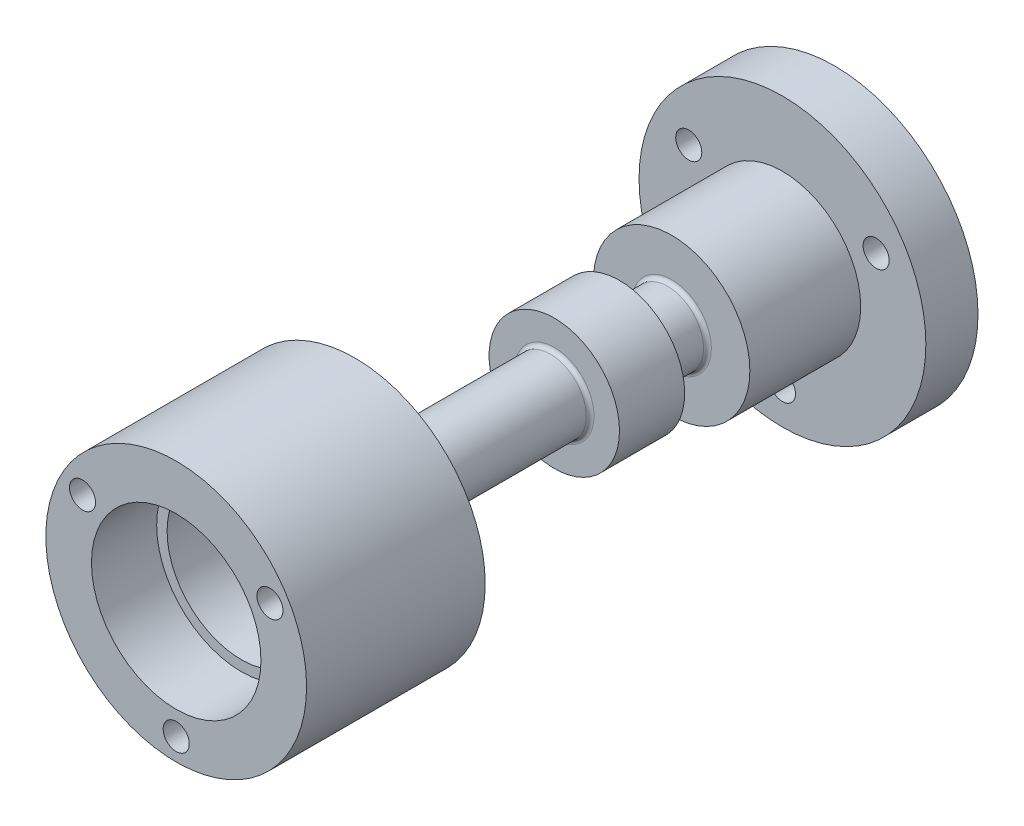
ISO-10303-21;
HEADER;
FILE_DESCRIPTION(('STEP AP214'),'2;1');
FILE_NAME('part.step','',(''),(''),'','','');
FILE_SCHEMA(('AUTOMOTIVE_DESIGN { 1 0 10303 214 1 1 1 1 }'));
ENDSEC;
DATA;
#1=APPLICATION_CONTEXT('core data for automotive mechanical design processes');
#2=APPLICATION_PROTOCOL_DEFINITION('international standard','automotive_design',2000,#1);
#3=PRODUCT_CONTEXT('',#1,'mechanical');
#4=PRODUCT('Part','Part','',(#3));
#5=PRODUCT_RELATED_PRODUCT_CATEGORY('part','',(#4));
#6=PRODUCT_DEFINITION_FORMATION('','',#4);
#7=PRODUCT_DEFINITION_CONTEXT('part definition',#1,'design');
#8=PRODUCT_DEFINITION('design','',#6,#7);
#9=PRODUCT_DEFINITION_SHAPE('','',#8);
#10=(LENGTH_UNIT() NAMED_UNIT(*) SI_UNIT(.MILLI.,.METRE.));
#11=(NAMED_UNIT(*) PLANE_ANGLE_UNIT() SI_UNIT($,.RADIAN.));
#12=(NAMED_UNIT(*) SI_UNIT($,.STERADIAN.) SOLID_ANGLE_UNIT());
#13=UNCERTAINTY_MEASURE_WITH_UNIT(LENGTH_MEASURE(1.E-05),#10,'distance_accuracy_value','');
#14=(GEOMETRIC_REPRESENTATION_CONTEXT(3) GLOBAL_UNCERTAINTY_ASSIGNED_CONTEXT((#13)) GLOBAL_UNIT_ASSIGNED_CONTEXT((#10,
#11,#12)) REPRESENTATION_CONTEXT('',''));
#15=CARTESIAN_POINT('',(0.,0.,0.));
#16=DIRECTION('',(0.,0.,1.));
#17=DIRECTION('',(1.,0.,0.));
#18=AXIS2_PLACEMENT_3D('',#15,#16,#17);
#19=CARTESIAN_POINT('',(0.,0.,32.81));
#20=DIRECTION('',(0.,0.,-1.));
#21=DIRECTION('',(-1.,0.,0.));
#22=AXIS2_PLACEMENT_3D('',#19,#20,#21);
#23=CYLINDRICAL_SURFACE('',#22,2.75);
#24=CARTESIAN_POINT('',(0.,0.,17.8));
#25=DIRECTION('',(0.,0.,1.));
#26=DIRECTION('',(1.,0.,0.));
#27=AXIS2_PLACEMENT_3D('',#24,#25,#26);
#28=CIRCLE('',#27,2.75);
#29=CARTESIAN_POINT('',(2.75,0.,17.8));
#30=VERTEX_POINT('',#29);
#31=EDGE_CURVE('E65',#30,#30,#28,.T.);
#32=ORIENTED_EDGE('',*,*,#31,.T.);
#33=EDGE_LOOP('',(#32));
#34=FACE_BOUND('',#33,.T.);
#35=CARTESIAN_POINT('',(0.,0.,32.8));
#36=DIRECTION('',(0.,0.,1.));
#37=DIRECTION('',(1.,0.,0.));
#38=AXIS2_PLACEMENT_3D('',#35,#36,#37);
#39=CIRCLE('',#38,2.75);
#40=CARTESIAN_POINT('',(2.75,0.,32.8));
#41=VERTEX_POINT('',#40);
#42=EDGE_CURVE('E63',#41,#41,#39,.T.);
#43=ORIENTED_EDGE('',*,*,#42,.F.);
#44=EDGE_LOOP('',(#43));
#45=FACE_BOUND('',#44,.T.);
#46=ADVANCED_FACE('F39',(#34,#45),#23,.T.);
#47=CARTESIAN_POINT('',(0.,0.,35.));
#48=DIRECTION('',(0.,0.,-1.));
#49=DIRECTION('',(-1.,0.,0.));
#50=AXIS2_PLACEMENT_3D('',#47,#48,#49);
#51=CYLINDRICAL_SURFACE('',#50,10.);
#52=CARTESIAN_POINT('',(0.,0.,32.8));
#53=DIRECTION('',(0.,0.,1.));
#54=DIRECTION('',(1.,0.,0.));
#55=AXIS2_PLACEMENT_3D('',#52,#53,#54);
#56=CIRCLE('',#55,10.);
#57=CARTESIAN_POINT('',(10.,0.,32.8));
#58=VERTEX_POINT('',#57);
#59=EDGE_CURVE('E71',#58,#58,#56,.T.);
#60=ORIENTED_EDGE('',*,*,#59,.T.);
#61=EDGE_LOOP('',(#60));
#62=FACE_BOUND('',#61,.T.);
#63=CARTESIAN_POINT('',(0.,0.,46.5));
#64=DIRECTION('',(0.,0.,1.));
#65=DIRECTION('',(1.,0.,0.));
#66=AXIS2_PLACEMENT_3D('',#63,#64,#65);
#67=CIRCLE('',#66,10.);
#68=CARTESIAN_POINT('',(10.,0.,46.5));
#69=VERTEX_POINT('',#68);
#70=EDGE_CURVE('E82',#69,#69,#67,.T.);
#71=ORIENTED_EDGE('',*,*,#70,.F.);
#72=EDGE_LOOP('',(#71));
#73=FACE_BOUND('',#72,.T.);
#74=ADVANCED_FACE('F164',(#62,#73),#51,.T.);
#75=CARTESIAN_POINT('',(0.,0.,32.8));
#76=DIRECTION('',(0.,0.,1.));
#77=DIRECTION('',(1.,0.,0.));
#78=AXIS2_PLACEMENT_3D('',#75,#76,#77);
#79=PLANE('',#78);
#80=ORIENTED_EDGE('',*,*,#42,.T.);
#81=EDGE_LOOP('',(#80));
#82=FACE_BOUND('',#81,.T.);
#83=ORIENTED_EDGE('',*,*,#59,.F.);
#84=EDGE_LOOP('',(#83));
#85=FACE_BOUND('',#84,.T.);
#86=ADVANCED_FACE('F175',(#82,#85),#79,.F.);
#87=CARTESIAN_POINT('',(0.,0.,46.5));
#88=DIRECTION('',(0.,0.,1.));
#89=DIRECTION('',(1.,0.,0.));
#90=AXIS2_PLACEMENT_3D('',#87,#88,#89);
#91=PLANE('',#90);
#92=CARTESIAN_POINT('',(7.18801085141084,4.15,46.5));
#93=DIRECTION('',(0.,0.,1.));
#94=DIRECTION('',(1.,0.,0.));
#95=AXIS2_PLACEMENT_3D('',#92,#93,#94);
#96=CIRCLE('',#95,1.);
#97=CARTESIAN_POINT('',(8.18801085141084,4.15,46.5));
#98=VERTEX_POINT('',#97);
#99=EDGE_CURVE('E121',#98,#98,#96,.T.);
#100=ORIENTED_EDGE('',*,*,#99,.F.);
#101=EDGE_LOOP('',(#100));
#102=FACE_BOUND('',#101,.T.);
#103=CARTESIAN_POINT('',(-7.18801085141084,4.15,46.5));
#104=DIRECTION('',(0.,0.,1.));
#105=DIRECTION('',(1.,0.,0.));
#106=AXIS2_PLACEMENT_3D('',#103,#104,#105);
#107=CIRCLE('',#106,1.);
#108=CARTESIAN_POINT('',(-6.18801085141084,4.15,46.5));
#109=VERTEX_POINT('',#108);
#110=EDGE_CURVE('E122',#109,#109,#107,.T.);
#111=ORIENTED_EDGE('',*,*,#110,.F.);
#112=EDGE_LOOP('',(#111));
#113=FACE_BOUND('',#112,.T.);
#114=CARTESIAN_POINT('',(0.,-8.3,46.5));
#115=DIRECTION('',(0.,0.,1.));
#116=DIRECTION('',(1.,0.,0.));
#117=AXIS2_PLACEMENT_3D('',#114,#115,#116);
#118=CIRCLE('',#117,1.);
#119=CARTESIAN_POINT('',(0.999999999999999,-8.3,46.5));
#120=VERTEX_POINT('',#119);
#121=EDGE_CURVE('E112',#120,#120,#118,.T.);
#122=ORIENTED_EDGE('',*,*,#121,.F.);
#123=EDGE_LOOP('',(#122));
#124=FACE_BOUND('',#123,.T.);
#125=ORIENTED_EDGE('',*,*,#70,.T.);
#126=EDGE_LOOP('',(#125));
#127=FACE_BOUND('',#126,.T.);
#128=CARTESIAN_POINT('',(0.,0.,46.5));
#129=DIRECTION('',(0.,0.,1.));
#130=DIRECTION('',(1.,0.,0.));
#131=AXIS2_PLACEMENT_3D('',#128,#129,#130);
#132=CIRCLE('',#131,6.5);
#133=CARTESIAN_POINT('',(6.5,0.,46.5));
#134=VERTEX_POINT('',#133);
#135=EDGE_CURVE('E86',#134,#134,#132,.T.);
#136=ORIENTED_EDGE('',*,*,#135,.F.);
#137=EDGE_LOOP('',(#136));
#138=FACE_BOUND('',#137,.T.);
#139=ADVANCED_FACE('F250',(#102,#113,#124,#127,#138),#91,.T.);
#140=CARTESIAN_POINT('',(0.,0.,46.5));
#141=DIRECTION('',(0.,0.,-1.));
#142=DIRECTION('',(-1.,0.,0.));
#143=AXIS2_PLACEMENT_3D('',#140,#141,#142);
#144=CYLINDRICAL_SURFACE('',#143,6.5);
#145=ORIENTED_EDGE('',*,*,#135,.T.);
#146=EDGE_LOOP('',(#145));
#147=FACE_BOUND('',#146,.T.);
#148=CARTESIAN_POINT('',(0.,0.,41.5));
#149=DIRECTION('',(0.,0.,1.));
#150=DIRECTION('',(1.,0.,0.));
#151=AXIS2_PLACEMENT_3D('',#148,#149,#150);
#152=CIRCLE('',#151,6.5);
#153=CARTESIAN_POINT('',(6.5,0.,41.5));
#154=VERTEX_POINT('',#153);
#155=EDGE_CURVE('E90',#154,#154,#152,.T.);
#156=ORIENTED_EDGE('',*,*,#155,.F.);
#157=EDGE_LOOP('',(#156));
#158=FACE_BOUND('',#157,.T.);
#159=ADVANCED_FACE('F243',(#147,#158),#144,.F.);
#160=CARTESIAN_POINT('',(0.,0.,35.));
#161=DIRECTION('',(0.,0.,1.));
#162=DIRECTION('',(1.,0.,0.));
#163=AXIS2_PLACEMENT_3D('',#160,#161,#162);
#164=PLANE('',#163);
#165=CARTESIAN_POINT('',(0.,0.,35.));
#166=DIRECTION('',(0.,0.,1.));
#167=DIRECTION('',(1.,0.,0.));
#168=AXIS2_PLACEMENT_3D('',#165,#166,#167);
#169=CIRCLE('',#168,5.7);
#170=CARTESIAN_POINT('',(-5.7,0.,35.));
#171=VERTEX_POINT('',#170);
#172=EDGE_CURVE('E76',#171,#171,#169,.T.);
#173=ORIENTED_EDGE('',*,*,#172,.T.);
#174=EDGE_LOOP('',(#173));
#175=FACE_BOUND('',#174,.T.);
#176=ADVANCED_FACE('F246',(#175),#164,.T.);
#177=CARTESIAN_POINT('',(0.,0.,41.5));
#178=DIRECTION('',(0.,0.,-1.));
#179=DIRECTION('',(-1.,0.,0.));
#180=AXIS2_PLACEMENT_3D('',#177,#178,#179);
#181=CYLINDRICAL_SURFACE('',#180,5.7);
#182=CARTESIAN_POINT('',(0.,0.,41.5));
#183=DIRECTION('',(0.,0.,1.));
#184=DIRECTION('',(1.,0.,0.));
#185=AXIS2_PLACEMENT_3D('',#182,#183,#184);
#186=CIRCLE('',#185,5.7);
#187=CARTESIAN_POINT('',(-5.7,0.,41.5));
#188=VERTEX_POINT('',#187);
#189=EDGE_CURVE('E80',#188,#188,#186,.T.);
#190=CARTESIAN_POINT('',(-5.7,0.,41.5));
#191=CARTESIAN_POINT('',(-5.7,0.,41.4322916666667));
#192=CARTESIAN_POINT('',(-5.7,0.,41.3645833333333));
#193=CARTESIAN_POINT('',(-5.7,0.,41.2291666666667));
#194=CARTESIAN_POINT('',(-5.7,0.,41.1614583333333));
#195=CARTESIAN_POINT('',(-5.7,0.,41.0260416666667));
#196=CARTESIAN_POINT('',(-5.7,0.,40.9583333333333));
#197=CARTESIAN_POINT('',(-5.7,0.,40.8229166666667));
#198=CARTESIAN_POINT('',(-5.7,0.,40.7552083333333));
#199=CARTESIAN_POINT('',(-5.7,0.,40.6197916666667));
#200=CARTESIAN_POINT('',(-5.7,0.,40.5520833333333));
#201=CARTESIAN_POINT('',(-5.7,0.,40.4166666666667));
#202=CARTESIAN_POINT('',(-5.7,0.,40.3489583333333));
#203=CARTESIAN_POINT('',(-5.7,0.,40.2135416666667));
#204=CARTESIAN_POINT('',(-5.7,0.,40.1458333333333));
#205=CARTESIAN_POINT('',(-5.7,0.,40.0104166666667));
#206=CARTESIAN_POINT('',(-5.7,0.,39.9427083333333));
#207=CARTESIAN_POINT('',(-5.7,0.,39.8072916666667));
#208=CARTESIAN_POINT('',(-5.7,0.,39.7395833333333));
#209=CARTESIAN_POINT('',(-5.7,0.,39.6041666666667));
#210=CARTESIAN_POINT('',(-5.7,0.,39.5364583333333));
#211=CARTESIAN_POINT('',(-5.7,0.,39.4010416666667));
#212=CARTESIAN_POINT('',(-5.7,0.,39.3333333333333));
#213=CARTESIAN_POINT('',(-5.7,0.,39.1979166666667));
#214=CARTESIAN_POINT('',(-5.7,0.,39.1302083333333));
#215=CARTESIAN_POINT('',(-5.7,0.,38.9947916666667));
#216=CARTESIAN_POINT('',(-5.7,0.,38.9270833333333));
#217=CARTESIAN_POINT('',(-5.7,0.,38.7916666666667));
#218=CARTESIAN_POINT('',(-5.7,0.,38.7239583333333));
#219=CARTESIAN_POINT('',(-5.7,0.,38.5885416666667));
#220=CARTESIAN_POINT('',(-5.7,0.,38.5208333333333));
#221=CARTESIAN_POINT('',(-5.7,0.,38.3854166666667));
#222=CARTESIAN_POINT('',(-5.7,0.,38.3177083333333));
#223=CARTESIAN_POINT('',(-5.7,0.,38.1822916666667));
#224=CARTESIAN_POINT('',(-5.7,0.,38.1145833333333));
#225=CARTESIAN_POINT('',(-5.7,0.,37.9791666666667));
#226=CARTESIAN_POINT('',(-5.7,0.,37.9114583333333));
#227=CARTESIAN_POINT('',(-5.7,0.,37.7760416666667));
#228=CARTESIAN_POINT('',(-5.7,0.,37.7083333333333));
#229=CARTESIAN_POINT('',(-5.7,0.,37.5729166666667));
#230=CARTESIAN_POINT('',(-5.7,0.,37.5052083333333));
#231=CARTESIAN_POINT('',(-5.7,0.,37.3697916666667));
#232=CARTESIAN_POINT('',(-5.7,0.,37.3020833333333));
#233=CARTESIAN_POINT('',(-5.7,0.,37.1666666666667));
#234=CARTESIAN_POINT('',(-5.7,0.,37.0989583333333));
#235=CARTESIAN_POINT('',(-5.7,0.,36.9635416666667));
#236=CARTESIAN_POINT('',(-5.7,0.,36.8958333333333));
#237=CARTESIAN_POINT('',(-5.7,0.,36.7604166666667));
#238=CARTESIAN_POINT('',(-5.7,0.,36.6927083333333));
#239=CARTESIAN_POINT('',(-5.7,0.,36.5572916666667));
#240=CARTESIAN_POINT('',(-5.7,0.,36.4895833333333));
#241=CARTESIAN_POINT('',(-5.7,0.,36.3541666666667));
#242=CARTESIAN_POINT('',(-5.7,0.,36.2864583333333));
#243=CARTESIAN_POINT('',(-5.7,0.,36.1510416666667));
#244=CARTESIAN_POINT('',(-5.7,0.,36.0833333333333));
#245=CARTESIAN_POINT('',(-5.7,0.,35.9479166666667));
#246=CARTESIAN_POINT('',(-5.7,0.,35.8802083333333));
#247=CARTESIAN_POINT('',(-5.7,0.,35.7447916666667));
#248=CARTESIAN_POINT('',(-5.7,0.,35.6770833333333));
#249=CARTESIAN_POINT('',(-5.7,0.,35.5416666666667));
#250=CARTESIAN_POINT('',(-5.7,0.,35.4739583333333));
#251=CARTESIAN_POINT('',(-5.7,0.,35.3385416666667));
#252=CARTESIAN_POINT('',(-5.7,0.,35.2708333333333));
#253=CARTESIAN_POINT('',(-5.7,0.,35.1354166666667));
#254=CARTESIAN_POINT('',(-5.7,0.,35.0677083333333));
#255=CARTESIAN_POINT('',(-5.7,0.,35.));
#256=B_SPLINE_CURVE_WITH_KNOTS('',3,(#190,#191,#192,#193,#194,#195,#196,#197,#198,#199,#200,
#201,#202,#203,#204,#205,#206,#207,#208,#209,#210,#211,#212,#213,#214,#215,#216,#217,#218,#219,
#220,#221,#222,#223,#224,#225,#226,#227,#228,#229,#230,#231,#232,#233,#234,#235,#236,#237,#238,
#239,#240,#241,#242,#243,#244,#245,#246,#247,#248,#249,#250,#251,#252,#253,#254,#255),
.UNSPECIFIED.,.F.,.F.,(4,2,2,2,2,2,2,2,2,2,2,2,2,2,2,2,2,2,2,2,2,2,2,2,2,2,2,2,2,2,2,2,4),(0.,
0.203124999999998,0.406249999999997,0.609374999999995,0.812499999999994,1.015625,1.21875,
1.421875,1.62499999999999,1.828125,2.03125,2.234375,2.4375,2.64062499999999,2.84375,3.046875,
3.25,3.45312499999999,3.65625,3.859375,4.0625,4.26562499999999,4.46874999999999,4.671875,4.875,
5.078125,5.28124999999999,5.484375,5.6875,5.890625,6.09374999999999,6.29687499999999,6.5),.UNSPECIFIED.);
#257=EDGE_CURVE('BSEAM255',#188,#171,#256,.T.);
#258=ORIENTED_EDGE('',*,*,#189,.T.);
#259=ORIENTED_EDGE('',*,*,#172,.F.);
#260=ORIENTED_EDGE('',*,*,#257,.T.);
#261=ORIENTED_EDGE('',*,*,#257,.F.);
#262=EDGE_LOOP('',(#258,#260,#259,#261));
#263=FACE_BOUND('',#262,.T.);
#264=ADVANCED_FACE('F255',(#263),#181,.F.);
#265=CARTESIAN_POINT('',(0.,0.,41.5));
#266=DIRECTION('',(0.,0.,1.));
#267=DIRECTION('',(1.,0.,0.));
#268=AXIS2_PLACEMENT_3D('',#265,#266,#267);
#269=PLANE('',#268);
#270=ORIENTED_EDGE('',*,*,#189,.F.);
#271=EDGE_LOOP('',(#270));
#272=FACE_BOUND('',#271,.T.);
#273=ORIENTED_EDGE('',*,*,#155,.T.);
#274=EDGE_LOOP('',(#273));
#275=FACE_BOUND('',#274,.T.);
#276=ADVANCED_FACE('F253',(#272,#275),#269,.T.);
#277=CARTESIAN_POINT('',(0.,-8.3,42.2));
#278=DIRECTION('',(0.,0.,1.));
#279=DIRECTION('',(1.,0.,0.));
#280=AXIS2_PLACEMENT_3D('',#277,#278,#279);
#281=CYLINDRICAL_SURFACE('',#280,1.);
#282=CARTESIAN_POINT('',(0.,-8.3,42.2));
#283=DIRECTION('',(0.,0.,1.));
#284=DIRECTION('',(1.,0.,0.));
#285=AXIS2_PLACEMENT_3D('',#282,#283,#284);
#286=CIRCLE('',#285,1.);
#287=CARTESIAN_POINT('',(0.999999999999999,-8.3,42.2));
#288=VERTEX_POINT('',#287);
#289=EDGE_CURVE('E111',#288,#288,#286,.T.);
#290=CARTESIAN_POINT('',(0.999999999999999,-8.3,42.2));
#291=CARTESIAN_POINT('',(0.999999999999999,-8.3,42.2447916666667));
#292=CARTESIAN_POINT('',(0.999999999999999,-8.3,42.2895833333333));
#293=CARTESIAN_POINT('',(0.999999999999999,-8.3,42.3791666666667));
#294=CARTESIAN_POINT('',(0.999999999999999,-8.3,42.4239583333333));
#295=CARTESIAN_POINT('',(0.999999999999999,-8.3,42.5135416666667));
#296=CARTESIAN_POINT('',(0.999999999999999,-8.3,42.5583333333333));
#297=CARTESIAN_POINT('',(0.999999999999999,-8.3,42.6479166666667));
#298=CARTESIAN_POINT('',(0.999999999999999,-8.3,42.6927083333333));
#299=CARTESIAN_POINT('',(0.999999999999999,-8.3,42.7822916666667));
#300=CARTESIAN_POINT('',(0.999999999999999,-8.3,42.8270833333333));
#301=CARTESIAN_POINT('',(0.999999999999999,-8.3,42.9166666666667));
#302=CARTESIAN_POINT('',(0.999999999999999,-8.3,42.9614583333333));
#303=CARTESIAN_POINT('',(0.999999999999999,-8.3,43.0510416666667));
#304=CARTESIAN_POINT('',(0.999999999999999,-8.3,43.0958333333333));
#305=CARTESIAN_POINT('',(0.999999999999999,-8.3,43.1854166666667));
#306=CARTESIAN_POINT('',(0.999999999999999,-8.3,43.2302083333333));
#307=CARTESIAN_POINT('',(0.999999999999999,-8.3,43.3197916666667));
#308=CARTESIAN_POINT('',(0.999999999999999,-8.3,43.3645833333333));
#309=CARTESIAN_POINT('',(0.999999999999999,-8.3,43.4541666666667));
#310=CARTESIAN_POINT('',(0.999999999999999,-8.3,43.4989583333333));
#311=CARTESIAN_POINT('',(0.999999999999999,-8.3,43.5885416666667));
#312=CARTESIAN_POINT('',(0.999999999999999,-8.3,43.6333333333333));
#313=CARTESIAN_POINT('',(0.999999999999999,-8.3,43.7229166666667));
#314=CARTESIAN_POINT('',(0.999999999999999,-8.3,43.7677083333333));
#315=CARTESIAN_POINT('',(0.999999999999999,-8.3,43.8572916666667));
#316=CARTESIAN_POINT('',(0.999999999999999,-8.3,43.9020833333333));
#317=CARTESIAN_POINT('',(0.999999999999999,-8.3,43.9916666666667));
#318=CARTESIAN_POINT('',(0.999999999999999,-8.3,44.0364583333333));
#319=CARTESIAN_POINT('',(0.999999999999999,-8.3,44.1260416666667));
#320=CARTESIAN_POINT('',(0.999999999999999,-8.3,44.1708333333333));
#321=CARTESIAN_POINT('',(0.999999999999999,-8.3,44.2604166666667));
#322=CARTESIAN_POINT('',(0.999999999999999,-8.3,44.3052083333333));
#323=CARTESIAN_POINT('',(0.999999999999999,-8.3,44.3947916666667));
#324=CARTESIAN_POINT('',(0.999999999999999,-8.3,44.4395833333333));
#325=CARTESIAN_POINT('',(0.999999999999999,-8.3,44.5291666666667));
#326=CARTESIAN_POINT('',(0.999999999999999,-8.3,44.5739583333333));
#327=CARTESIAN_POINT('',(0.999999999999999,-8.3,44.6635416666667));
#328=CARTESIAN_POINT('',(0.999999999999999,-8.3,44.7083333333333));
#329=CARTESIAN_POINT('',(0.999999999999999,-8.3,44.7979166666667));
#330=CARTESIAN_POINT('',(0.999999999999999,-8.3,44.8427083333333));
#331=CARTESIAN_POINT('',(0.999999999999999,-8.3,44.9322916666667));
#332=CARTESIAN_POINT('',(0.999999999999999,-8.3,44.9770833333333));
#333=CARTESIAN_POINT('',(0.999999999999999,-8.3,45.0666666666667));
#334=CARTESIAN_POINT('',(0.999999999999999,-8.3,45.1114583333333));
#335=CARTESIAN_POINT('',(0.999999999999999,-8.3,45.2010416666667));
#336=CARTESIAN_POINT('',(0.999999999999999,-8.3,45.2458333333333));
#337=CARTESIAN_POINT('',(0.999999999999999,-8.3,45.3354166666667));
#338=CARTESIAN_POINT('',(0.999999999999999,-8.3,45.3802083333333));
#339=CARTESIAN_POINT('',(0.999999999999999,-8.3,45.4697916666667));
#340=CARTESIAN_POINT('',(0.999999999999999,-8.3,45.5145833333333));
#341=CARTESIAN_POINT('',(0.999999999999999,-8.3,45.6041666666667));
#342=CARTESIAN_POINT('',(0.999999999999999,-8.3,45.6489583333333));
#343=CARTESIAN_POINT('',(0.999999999999999,-8.3,45.7385416666667));
#344=CARTESIAN_POINT('',(0.999999999999999,-8.3,45.7833333333333));
#345=CARTESIAN_POINT('',(0.999999999999999,-8.3,45.8729166666667));
#346=CARTESIAN_POINT('',(0.999999999999999,-8.3,45.9177083333333));
#347=CARTESIAN_POINT('',(0.999999999999999,-8.3,46.0072916666667));
#348=CARTESIAN_POINT('',(0.999999999999999,-8.3,46.0520833333333));
#349=CARTESIAN_POINT('',(0.999999999999999,-8.3,46.1416666666667));
#350=CARTESIAN_POINT('',(0.999999999999999,-8.3,46.1864583333333));
#351=CARTESIAN_POINT('',(0.999999999999999,-8.3,46.2760416666667));
#352=CARTESIAN_POINT('',(0.999999999999999,-8.3,46.3208333333333));
#353=CARTESIAN_POINT('',(0.999999999999999,-8.3,46.4104166666667));
#354=CARTESIAN_POINT('',(0.999999999999999,-8.3,46.4552083333333));
#355=CARTESIAN_POINT('',(0.999999999999999,-8.3,46.5));
#356=B_SPLINE_CURVE_WITH_KNOTS('',3,(#290,#291,#292,#293,#294,#295,#296,#297,#298,#299,#300,
#301,#302,#303,#304,#305,#306,#307,#308,#309,#310,#311,#312,#313,#314,#315,#316,#317,#318,#319,
#320,#321,#322,#323,#324,#325,#326,#327,#328,#329,#330,#331,#332,#333,#334,#335,#336,#337,#338,
#339,#340,#341,#342,#343,#344,#345,#346,#347,#348,#349,#350,#351,#352,#353,#354,#355),
.UNSPECIFIED.,.F.,.F.,(4,2,2,2,2,2,2,2,2,2,2,2,2,2,2,2,2,2,2,2,2,2,2,2,2,2,2,2,2,2,2,2,4),(0.,
0.134375000000006,0.268750000000005,0.403125000000004,0.537500000000003,0.671875000000002,
0.806250000000001,0.940625,1.075,1.20937500000001,1.34375,1.478125,1.6125,1.746875,1.88125,
2.015625,2.15,2.28437500000001,2.41875,2.553125,2.6875,2.821875,2.95625,3.090625,3.225,3.359375,
3.49375,3.628125,3.7625,3.896875,4.03125,4.165625,4.3),.UNSPECIFIED.);
#357=EDGE_CURVE('BSEAM256',#288,#120,#356,.T.);
#358=ORIENTED_EDGE('',*,*,#289,.F.);
#359=ORIENTED_EDGE('',*,*,#121,.T.);
#360=ORIENTED_EDGE('',*,*,#357,.T.);
#361=ORIENTED_EDGE('',*,*,#357,.F.);
#362=EDGE_LOOP('',(#358,#360,#359,#361));
#363=FACE_BOUND('',#362,.T.);
#364=ADVANCED_FACE('F256',(#363),#281,.F.);
#365=CARTESIAN_POINT('',(0.,-8.3,42.2));
#366=DIRECTION('',(0.,0.,1.));
#367=DIRECTION('',(1.,0.,0.));
#368=AXIS2_PLACEMENT_3D('',#365,#366,#367);
#369=PLANE('',#368);
#370=ORIENTED_EDGE('',*,*,#289,.T.);
#371=EDGE_LOOP('',(#370));
#372=FACE_BOUND('',#371,.T.);
#373=ADVANCED_FACE('F361',(#372),#369,.T.);
#374=CARTESIAN_POINT('',(-7.18801085141084,4.15,42.2));
#375=DIRECTION('',(0.,0.,1.));
#376=DIRECTION('',(1.,0.,0.));
#377=AXIS2_PLACEMENT_3D('',#374,#375,#376);
#378=CYLINDRICAL_SURFACE('',#377,1.);
#379=CARTESIAN_POINT('',(-7.18801085141084,4.15,42.2));
#380=DIRECTION('',(0.,0.,1.));
#381=DIRECTION('',(1.,0.,0.));
#382=AXIS2_PLACEMENT_3D('',#379,#380,#381);
#383=CIRCLE('',#382,1.);
#384=CARTESIAN_POINT('',(-6.18801085141084,4.15,42.2));
#385=VERTEX_POINT('',#384);
#386=EDGE_CURVE('E117',#385,#385,#383,.T.);
#387=CARTESIAN_POINT('',(-6.18801085141084,4.15,42.2));
#388=CARTESIAN_POINT('',(-6.18801085141084,4.15,42.2447916666667));
#389=CARTESIAN_POINT('',(-6.18801085141084,4.15,42.2895833333333));
#390=CARTESIAN_POINT('',(-6.18801085141084,4.15,42.3791666666667));
#391=CARTESIAN_POINT('',(-6.18801085141084,4.15,42.4239583333333));
#392=CARTESIAN_POINT('',(-6.18801085141084,4.15,42.5135416666667));
#393=CARTESIAN_POINT('',(-6.18801085141084,4.15,42.5583333333333));
#394=CARTESIAN_POINT('',(-6.18801085141084,4.15,42.6479166666667));
#395=CARTESIAN_POINT('',(-6.18801085141084,4.15,42.6927083333333));
#396=CARTESIAN_POINT('',(-6.18801085141084,4.15,42.7822916666667));
#397=CARTESIAN_POINT('',(-6.18801085141084,4.15,42.8270833333333));
#398=CARTESIAN_POINT('',(-6.18801085141084,4.15,42.9166666666667));
#399=CARTESIAN_POINT('',(-6.18801085141084,4.15,42.9614583333333));
#400=CARTESIAN_POINT('',(-6.18801085141084,4.15,43.0510416666667));
#401=CARTESIAN_POINT('',(-6.18801085141084,4.15,43.0958333333333));
#402=CARTESIAN_POINT('',(-6.18801085141084,4.15,43.1854166666667));
#403=CARTESIAN_POINT('',(-6.18801085141084,4.15,43.2302083333333));
#404=CARTESIAN_POINT('',(-6.18801085141084,4.15,43.3197916666667));
#405=CARTESIAN_POINT('',(-6.18801085141084,4.15,43.3645833333333));
#406=CARTESIAN_POINT('',(-6.18801085141084,4.15,43.4541666666667));
#407=CARTESIAN_POINT('',(-6.18801085141084,4.15,43.4989583333333));
#408=CARTESIAN_POINT('',(-6.18801085141084,4.15,43.5885416666667));
#409=CARTESIAN_POINT('',(-6.18801085141084,4.15,43.6333333333333));
#410=CARTESIAN_POINT('',(-6.18801085141084,4.15,43.7229166666667));
#411=CARTESIAN_POINT('',(-6.18801085141084,4.15,43.7677083333333));
#412=CARTESIAN_POINT('',(-6.18801085141084,4.15,43.8572916666667));
#413=CARTESIAN_POINT('',(-6.18801085141084,4.15,43.9020833333333));
#414=CARTESIAN_POINT('',(-6.18801085141084,4.15,43.9916666666667));
#415=CARTESIAN_POINT('',(-6.18801085141084,4.15,44.0364583333333));
#416=CARTESIAN_POINT('',(-6.18801085141084,4.15,44.1260416666667));
#417=CARTESIAN_POINT('',(-6.18801085141084,4.15,44.1708333333333));
#418=CARTESIAN_POINT('',(-6.18801085141084,4.15,44.2604166666667));
#419=CARTESIAN_POINT('',(-6.18801085141084,4.15,44.3052083333333));
#420=CARTESIAN_POINT('',(-6.18801085141084,4.15,44.3947916666667));
#421=CARTESIAN_POINT('',(-6.18801085141084,4.15,44.4395833333333));
#422=CARTESIAN_POINT('',(-6.18801085141084,4.15,44.5291666666667));
#423=CARTESIAN_POINT('',(-6.18801085141084,4.15,44.5739583333333));
#424=CARTESIAN_POINT('',(-6.18801085141084,4.15,44.6635416666667));
#425=CARTESIAN_POINT('',(-6.18801085141084,4.15,44.7083333333333));
#426=CARTESIAN_POINT('',(-6.18801085141084,4.15,44.7979166666667));
#427=CARTESIAN_POINT('',(-6.18801085141084,4.15,44.8427083333333));
#428=CARTESIAN_POINT('',(-6.18801085141084,4.15,44.9322916666667));
#429=CARTESIAN_POINT('',(-6.18801085141084,4.15,44.9770833333333));
#430=CARTESIAN_POINT('',(-6.18801085141084,4.15,45.0666666666667));
#431=CARTESIAN_POINT('',(-6.18801085141084,4.15,45.1114583333333));
#432=CARTESIAN_POINT('',(-6.18801085141084,4.15,45.2010416666667));
#433=CARTESIAN_POINT('',(-6.18801085141084,4.15,45.2458333333333));
#434=CARTESIAN_POINT('',(-6.18801085141084,4.15,45.3354166666667));
#435=CARTESIAN_POINT('',(-6.18801085141084,4.15,45.3802083333333));
#436=CARTESIAN_POINT('',(-6.18801085141084,4.15,45.4697916666667));
#437=CARTESIAN_POINT('',(-6.18801085141084,4.15,45.5145833333333));
#438=CARTESIAN_POINT('',(-6.18801085141084,4.15,45.6041666666667));
#439=CARTESIAN_POINT('',(-6.18801085141084,4.15,45.6489583333333));
#440=CARTESIAN_POINT('',(-6.18801085141084,4.15,45.7385416666667));
#441=CARTESIAN_POINT('',(-6.18801085141084,4.15,45.7833333333333));
#442=CARTESIAN_POINT('',(-6.18801085141084,4.15,45.8729166666667));
#443=CARTESIAN_POINT('',(-6.18801085141084,4.15,45.9177083333333));
#444=CARTESIAN_POINT('',(-6.18801085141084,4.15,46.0072916666667));
#445=CARTESIAN_POINT('',(-6.18801085141084,4.15,46.0520833333333));
#446=CARTESIAN_POINT('',(-6.18801085141084,4.15,46.1416666666667));
#447=CARTESIAN_POINT('',(-6.18801085141084,4.15,46.1864583333333));
#448=CARTESIAN_POINT('',(-6.18801085141084,4.15,46.2760416666667));
#449=CARTESIAN_POINT('',(-6.18801085141084,4.15,46.3208333333333));
#450=CARTESIAN_POINT('',(-6.18801085141084,4.15,46.4104166666667));
#451=CARTESIAN_POINT('',(-6.18801085141084,4.15,46.4552083333333));
#452=CARTESIAN_POINT('',(-6.18801085141084,4.15,46.5));
#453=B_SPLINE_CURVE_WITH_KNOTS('',3,(#387,#388,#389,#390,#391,#392,#393,#394,#395,#396,#397,
#398,#399,#400,#401,#402,#403,#404,#405,#406,#407,#408,#409,#410,#411,#412,#413,#414,#415,#416,
#417,#418,#419,#420,#421,#422,#423,#424,#425,#426,#427,#428,#429,#430,#431,#432,#433,#434,#435,
#436,#437,#438,#439,#440,#441,#442,#443,#444,#445,#446,#447,#448,#449,#450,#451,#452),
.UNSPECIFIED.,.F.,.F.,(4,2,2,2,2,2,2,2,2,2,2,2,2,2,2,2,2,2,2,2,2,2,2,2,2,2,2,2,2,2,2,2,4),(0.,
0.134375000000006,0.268750000000005,0.403125000000004,0.537500000000003,0.671875000000002,
0.806250000000001,0.940625,1.075,1.20937500000001,1.34375,1.478125,1.6125,1.746875,1.88125,
2.015625,2.15,2.28437500000001,2.41875,2.553125,2.6875,2.821875,2.95625,3.090625,3.225,3.359375,
3.49375,3.628125,3.7625,3.896875,4.03125,4.165625,4.3),.UNSPECIFIED.);
#454=EDGE_CURVE('BSEAM375',#385,#109,#453,.T.);
#455=ORIENTED_EDGE('',*,*,#386,.F.);
#456=ORIENTED_EDGE('',*,*,#110,.T.);
#457=ORIENTED_EDGE('',*,*,#454,.T.);
#458=ORIENTED_EDGE('',*,*,#454,.F.);
#459=EDGE_LOOP('',(#455,#457,#456,#458));
#460=FACE_BOUND('',#459,.T.);
#461=ADVANCED_FACE('F375',(#460),#378,.F.);
#462=CARTESIAN_POINT('',(-7.18801085141084,4.15,42.2));
#463=DIRECTION('',(0.,0.,1.));
#464=DIRECTION('',(1.,0.,0.));
#465=AXIS2_PLACEMENT_3D('',#462,#463,#464);
#466=PLANE('',#465);
#467=ORIENTED_EDGE('',*,*,#386,.T.);
#468=EDGE_LOOP('',(#467));
#469=FACE_BOUND('',#468,.T.);
#470=ADVANCED_FACE('F382',(#469),#466,.T.);
#471=CARTESIAN_POINT('',(7.18801085141084,4.15,42.2));
#472=DIRECTION('',(0.,0.,1.));
#473=DIRECTION('',(1.,0.,0.));
#474=AXIS2_PLACEMENT_3D('',#471,#472,#473);
#475=CYLINDRICAL_SURFACE('',#474,1.);
#476=CARTESIAN_POINT('',(7.18801085141084,4.15,42.2));
#477=DIRECTION('',(0.,0.,1.));
#478=DIRECTION('',(1.,0.,0.));
#479=AXIS2_PLACEMENT_3D('',#476,#477,#478);
#480=CIRCLE('',#479,1.);
#481=CARTESIAN_POINT('',(8.18801085141084,4.15,42.2));
#482=VERTEX_POINT('',#481);
#483=EDGE_CURVE('E106',#482,#482,#480,.T.);
#484=CARTESIAN_POINT('',(8.18801085141084,4.15,42.2));
#485=CARTESIAN_POINT('',(8.18801085141084,4.15,42.2447916666667));
#486=CARTESIAN_POINT('',(8.18801085141084,4.15,42.2895833333333));
#487=CARTESIAN_POINT('',(8.18801085141084,4.15,42.3791666666667));
#488=CARTESIAN_POINT('',(8.18801085141084,4.15,42.4239583333333));
#489=CARTESIAN_POINT('',(8.18801085141084,4.15,42.5135416666667));
#490=CARTESIAN_POINT('',(8.18801085141084,4.15,42.5583333333333));
#491=CARTESIAN_POINT('',(8.18801085141084,4.15,42.6479166666667));
#492=CARTESIAN_POINT('',(8.18801085141084,4.15,42.6927083333333));
#493=CARTESIAN_POINT('',(8.18801085141084,4.15,42.7822916666667));
#494=CARTESIAN_POINT('',(8.18801085141084,4.15,42.8270833333333));
#495=CARTESIAN_POINT('',(8.18801085141084,4.15,42.9166666666667));
#496=CARTESIAN_POINT('',(8.18801085141084,4.15,42.9614583333333));
#497=CARTESIAN_POINT('',(8.18801085141084,4.15,43.0510416666667));
#498=CARTESIAN_POINT('',(8.18801085141084,4.15,43.0958333333333));
#499=CARTESIAN_POINT('',(8.18801085141084,4.15,43.1854166666667));
#500=CARTESIAN_POINT('',(8.18801085141084,4.15,43.2302083333333));
#501=CARTESIAN_POINT('',(8.18801085141084,4.15,43.3197916666667));
#502=CARTESIAN_POINT('',(8.18801085141084,4.15,43.3645833333333));
#503=CARTESIAN_POINT('',(8.18801085141084,4.15,43.4541666666667));
#504=CARTESIAN_POINT('',(8.18801085141084,4.15,43.4989583333333));
#505=CARTESIAN_POINT('',(8.18801085141084,4.15,43.5885416666667));
#506=CARTESIAN_POINT('',(8.18801085141084,4.15,43.6333333333333));
#507=CARTESIAN_POINT('',(8.18801085141084,4.15,43.7229166666667));
#508=CARTESIAN_POINT('',(8.18801085141084,4.15,43.7677083333333));
#509=CARTESIAN_POINT('',(8.18801085141084,4.15,43.8572916666667));
#510=CARTESIAN_POINT('',(8.18801085141084,4.15,43.9020833333333));
#511=CARTESIAN_POINT('',(8.18801085141084,4.15,43.9916666666667));
#512=CARTESIAN_POINT('',(8.18801085141084,4.15,44.0364583333333));
#513=CARTESIAN_POINT('',(8.18801085141084,4.15,44.1260416666667));
#514=CARTESIAN_POINT('',(8.18801085141084,4.15,44.1708333333333));
#515=CARTESIAN_POINT('',(8.18801085141084,4.15,44.2604166666667));
#516=CARTESIAN_POINT('',(8.18801085141084,4.15,44.3052083333333));
#517=CARTESIAN_POINT('',(8.18801085141084,4.15,44.3947916666667));
#518=CARTESIAN_POINT('',(8.18801085141084,4.15,44.4395833333333));
#519=CARTESIAN_POINT('',(8.18801085141084,4.15,44.5291666666667));
#520=CARTESIAN_POINT('',(8.18801085141084,4.15,44.5739583333333));
#521=CARTESIAN_POINT('',(8.18801085141084,4.15,44.6635416666667));
#522=CARTESIAN_POINT('',(8.18801085141084,4.15,44.7083333333333));
#523=CARTESIAN_POINT('',(8.18801085141084,4.15,44.7979166666667));
#524=CARTESIAN_POINT('',(8.18801085141084,4.15,44.8427083333333));
#525=CARTESIAN_POINT('',(8.18801085141084,4.15,44.9322916666667));
#526=CARTESIAN_POINT('',(8.18801085141084,4.15,44.9770833333333));
#527=CARTESIAN_POINT('',(8.18801085141084,4.15,45.0666666666667));
#528=CARTESIAN_POINT('',(8.18801085141084,4.15,45.1114583333333));
#529=CARTESIAN_POINT('',(8.18801085141084,4.15,45.2010416666667));
#530=CARTESIAN_POINT('',(8.18801085141084,4.15,45.2458333333333));
#531=CARTESIAN_POINT('',(8.18801085141084,4.15,45.3354166666667));
#532=CARTESIAN_POINT('',(8.18801085141084,4.15,45.3802083333333));
#533=CARTESIAN_POINT('',(8.18801085141084,4.15,45.4697916666667));
#534=CARTESIAN_POINT('',(8.18801085141084,4.15,45.5145833333333));
#535=CARTESIAN_POINT('',(8.18801085141084,4.15,45.6041666666667));
#536=CARTESIAN_POINT('',(8.18801085141084,4.15,45.6489583333333));
#537=CARTESIAN_POINT('',(8.18801085141084,4.15,45.7385416666667));
#538=CARTESIAN_POINT('',(8.18801085141084,4.15,45.7833333333333));
#539=CARTESIAN_POINT('',(8.18801085141084,4.15,45.8729166666667));
#540=CARTESIAN_POINT('',(8.18801085141084,4.15,45.9177083333333));
#541=CARTESIAN_POINT('',(8.18801085141084,4.15,46.0072916666667));
#542=CARTESIAN_POINT('',(8.18801085141084,4.15,46.0520833333333));
#543=CARTESIAN_POINT('',(8.18801085141084,4.15,46.1416666666667));
#544=CARTESIAN_POINT('',(8.18801085141084,4.15,46.1864583333333));
#545=CARTESIAN_POINT('',(8.18801085141084,4.15,46.2760416666667));
#546=CARTESIAN_POINT('',(8.18801085141084,4.15,46.3208333333333));
#547=CARTESIAN_POINT('',(8.18801085141084,4.15,46.4104166666667));
#548=CARTESIAN_POINT('',(8.18801085141084,4.15,46.4552083333333));
#549=CARTESIAN_POINT('',(8.18801085141084,4.15,46.5));
#550=B_SPLINE_CURVE_WITH_KNOTS('',3,(#484,#485,#486,#487,#488,#489,#490,#491,#492,#493,#494,
#495,#496,#497,#498,#499,#500,#501,#502,#503,#504,#505,#506,#507,#508,#509,#510,#511,#512,#513,
#514,#515,#516,#517,#518,#519,#520,#521,#522,#523,#524,#525,#526,#527,#528,#529,#530,#531,#532,
#533,#534,#535,#536,#537,#538,#539,#540,#541,#542,#543,#544,#545,#546,#547,#548,#549),
.UNSPECIFIED.,.F.,.F.,(4,2,2,2,2,2,2,2,2,2,2,2,2,2,2,2,2,2,2,2,2,2,2,2,2,2,2,2,2,2,2,2,4),(0.,
0.134375000000006,0.268750000000005,0.403125000000004,0.537500000000003,0.671875000000002,
0.806250000000001,0.940625,1.075,1.20937500000001,1.34375,1.478125,1.6125,1.746875,1.88125,
2.015625,2.15,2.28437500000001,2.41875,2.553125,2.6875,2.821875,2.95625,3.090625,3.225,3.359375,
3.49375,3.628125,3.7625,3.896875,4.03125,4.165625,4.3),.UNSPECIFIED.);
#551=EDGE_CURVE('BSEAM388',#482,#98,#550,.T.);
#552=ORIENTED_EDGE('',*,*,#483,.F.);
#553=ORIENTED_EDGE('',*,*,#99,.T.);
#554=ORIENTED_EDGE('',*,*,#551,.T.);
#555=ORIENTED_EDGE('',*,*,#551,.F.);
#556=EDGE_LOOP('',(#552,#554,#553,#555));
#557=FACE_BOUND('',#556,.T.);
#558=ADVANCED_FACE('F388',(#557),#475,.F.);
#559=CARTESIAN_POINT('',(7.18801085141084,4.15,42.2));
#560=DIRECTION('',(0.,0.,1.));
#561=DIRECTION('',(1.,0.,0.));
#562=AXIS2_PLACEMENT_3D('',#559,#560,#561);
#563=PLANE('',#562);
#564=ORIENTED_EDGE('',*,*,#483,.T.);
#565=EDGE_LOOP('',(#564));
#566=FACE_BOUND('',#565,.T.);
#567=ADVANCED_FACE('F147',(#566),#563,.T.);
#568=CARTESIAN_POINT('',(0.,0.,17.5));
#569=DIRECTION('',(0.,0.,-1.));
#570=DIRECTION('',(-1.,0.,0.));
#571=AXIS2_PLACEMENT_3D('',#568,#569,#570);
#572=CYLINDRICAL_SURFACE('',#571,5.);
#573=CARTESIAN_POINT('',(0.,0.,17.5));
#574=DIRECTION('',(0.,0.,1.));
#575=DIRECTION('',(1.,0.,0.));
#576=AXIS2_PLACEMENT_3D('',#573,#574,#575);
#577=CIRCLE('',#576,5.);
#578=CARTESIAN_POINT('',(5.,0.,17.5));
#579=VERTEX_POINT('',#578);
#580=EDGE_CURVE('E135',#579,#579,#577,.T.);
#581=ORIENTED_EDGE('',*,*,#580,.F.);
#582=EDGE_LOOP('',(#581));
#583=FACE_BOUND('',#582,.T.);
#584=CARTESIAN_POINT('',(0.,0.,12.5));
#585=DIRECTION('',(0.,0.,1.));
#586=DIRECTION('',(1.,0.,0.));
#587=AXIS2_PLACEMENT_3D('',#584,#585,#586);
#588=CIRCLE('',#587,5.);
#589=CARTESIAN_POINT('',(5.,0.,12.5));
#590=VERTEX_POINT('',#589);
#591=EDGE_CURVE('E134',#590,#590,#588,.T.);
#592=ORIENTED_EDGE('',*,*,#591,.T.);
#593=EDGE_LOOP('',(#592));
#594=FACE_BOUND('',#593,.T.);
#595=ADVANCED_FACE('F141',(#583,#594),#572,.T.);
#596=CARTESIAN_POINT('',(0.,0.,17.5));
#597=DIRECTION('',(0.,0.,1.));
#598=DIRECTION('',(1.,0.,0.));
#599=AXIS2_PLACEMENT_3D('',#596,#597,#598);
#600=PLANE('',#599);
#601=CARTESIAN_POINT('',(0.,0.,17.5));
#602=DIRECTION('',(0.,0.,1.));
#603=DIRECTION('',(1.,0.,0.));
#604=AXIS2_PLACEMENT_3D('',#601,#602,#603);
#605=CIRCLE('',#604,3.05);
#606=CARTESIAN_POINT('',(3.05,0.,17.5));
#607=VERTEX_POINT('',#606);
#608=EDGE_CURVE('E56',#607,#607,#605,.F.);
#609=ORIENTED_EDGE('',*,*,#608,.T.);
#610=EDGE_LOOP('',(#609));
#611=FACE_BOUND('',#610,.T.);
#612=ORIENTED_EDGE('',*,*,#580,.T.);
#613=EDGE_LOOP('',(#612));
#614=FACE_BOUND('',#613,.T.);
#615=ADVANCED_FACE('F142',(#611,#614),#600,.T.);
#616=CARTESIAN_POINT('',(0.,0.,12.5));
#617=DIRECTION('',(0.,0.,1.));
#618=DIRECTION('',(1.,0.,0.));
#619=AXIS2_PLACEMENT_3D('',#616,#617,#618);
#620=PLANE('',#619);
#621=CARTESIAN_POINT('',(0.,0.,12.5));
#622=DIRECTION('',(0.,0.,1.));
#623=DIRECTION('',(1.,0.,0.));
#624=AXIS2_PLACEMENT_3D('',#621,#622,#623);
#625=CIRCLE('',#624,3.05);
#626=CARTESIAN_POINT('',(3.05,0.,12.5));
#627=VERTEX_POINT('',#626);
#628=EDGE_CURVE('E10',#627,#627,#625,.T.);
#629=ORIENTED_EDGE('',*,*,#628,.T.);
#630=EDGE_LOOP('',(#629));
#631=FACE_BOUND('',#630,.T.);
#632=ORIENTED_EDGE('',*,*,#591,.F.);
#633=EDGE_LOOP('',(#632));
#634=FACE_BOUND('',#633,.T.);
#635=ADVANCED_FACE('F148',(#631,#634),#620,.F.);
#636=CARTESIAN_POINT('',(0.,0.,-4.));
#637=DIRECTION('',(0.,0.,1.));
#638=DIRECTION('',(1.,0.,0.));
#639=AXIS2_PLACEMENT_3D('',#636,#637,#638);
#640=PLANE('',#639);
#641=CARTESIAN_POINT('',(7.18801085141084,4.15,-4.));
#642=DIRECTION('',(0.,0.,-1.));
#643=DIRECTION('',(-1.,0.,0.));
#644=AXIS2_PLACEMENT_3D('',#641,#642,#643);
#645=CIRCLE('',#644,1.);
#646=CARTESIAN_POINT('',(6.18801085141084,4.15,-4.));
#647=VERTEX_POINT('',#646);
#648=EDGE_CURVE('E103',#647,#647,#645,.T.);
#649=ORIENTED_EDGE('',*,*,#648,.F.);
#650=EDGE_LOOP('',(#649));
#651=FACE_BOUND('',#650,.T.);
#652=CARTESIAN_POINT('',(-7.18801085141084,4.15,-4.));
#653=DIRECTION('',(0.,0.,-1.));
#654=DIRECTION('',(-1.,0.,0.));
#655=AXIS2_PLACEMENT_3D('',#652,#653,#654);
#656=CIRCLE('',#655,1.);
#657=CARTESIAN_POINT('',(-8.18801085141084,4.15,-4.));
#658=VERTEX_POINT('',#657);
#659=EDGE_CURVE('E102',#658,#658,#656,.T.);
#660=ORIENTED_EDGE('',*,*,#659,.F.);
#661=EDGE_LOOP('',(#660));
#662=FACE_BOUND('',#661,.T.);
#663=CARTESIAN_POINT('',(0.,-8.3,-4.));
#664=DIRECTION('',(0.,0.,-1.));
#665=DIRECTION('',(-1.,0.,0.));
#666=AXIS2_PLACEMENT_3D('',#663,#664,#665);
#667=CIRCLE('',#666,1.);
#668=CARTESIAN_POINT('',(-1.,-8.3,-4.));
#669=VERTEX_POINT('',#668);
#670=EDGE_CURVE('E105',#669,#669,#667,.T.);
#671=ORIENTED_EDGE('',*,*,#670,.F.);
#672=EDGE_LOOP('',(#671));
#673=FACE_BOUND('',#672,.T.);
#674=CARTESIAN_POINT('',(0.,0.,-4.));
#675=DIRECTION('',(0.,0.,1.));
#676=DIRECTION('',(1.,0.,0.));
#677=AXIS2_PLACEMENT_3D('',#674,#675,#676);
#678=CIRCLE('',#677,11.);
#679=CARTESIAN_POINT('',(11.,0.,-4.));
#680=VERTEX_POINT('',#679);
#681=EDGE_CURVE('E68',#680,#680,#678,.T.);
#682=ORIENTED_EDGE('',*,*,#681,.F.);
#683=EDGE_LOOP('',(#682));
#684=FACE_BOUND('',#683,.T.);
#685=ADVANCED_FACE('F155',(#651,#662,#673,#684),#640,.F.);
#686=CARTESIAN_POINT('',(0.,0.,0.));
#687=DIRECTION('',(0.,0.,-1.));
#688=DIRECTION('',(-1.,0.,0.));
#689=AXIS2_PLACEMENT_3D('',#686,#687,#688);
#690=CYLINDRICAL_SURFACE('',#689,11.);
#691=CARTESIAN_POINT('',(0.,0.,0.));
#692=DIRECTION('',(0.,0.,1.));
#693=DIRECTION('',(1.,0.,0.));
#694=AXIS2_PLACEMENT_3D('',#691,#692,#693);
#695=CIRCLE('',#694,11.);
#696=CARTESIAN_POINT('',(11.,0.,0.));
#697=VERTEX_POINT('',#696);
#698=EDGE_CURVE('E67',#697,#697,#695,.T.);
#699=ORIENTED_EDGE('',*,*,#698,.F.);
#700=EDGE_LOOP('',(#699));
#701=FACE_BOUND('',#700,.T.);
#702=ORIENTED_EDGE('',*,*,#681,.T.);
#703=EDGE_LOOP('',(#702));
#704=FACE_BOUND('',#703,.T.);
#705=ADVANCED_FACE('F158',(#701,#704),#690,.T.);
#706=CARTESIAN_POINT('',(0.,-8.3,0.00999999999999959));
#707=DIRECTION('',(0.,0.,-1.));
#708=DIRECTION('',(-1.,0.,0.));
#709=AXIS2_PLACEMENT_3D('',#706,#707,#708);
#710=CYLINDRICAL_SURFACE('',#709,1.);
#711=CARTESIAN_POINT('',(0.,-8.3,0.));
#712=DIRECTION('',(0.,0.,1.));
#713=DIRECTION('',(1.,0.,0.));
#714=AXIS2_PLACEMENT_3D('',#711,#712,#713);
#715=CIRCLE('',#714,1.);
#716=CARTESIAN_POINT('',(0.999999999999999,-8.3,0.));
#717=VERTEX_POINT('',#716);
#718=EDGE_CURVE('E96',#717,#717,#715,.T.);
#719=ORIENTED_EDGE('',*,*,#718,.T.);
#720=EDGE_LOOP('',(#719));
#721=FACE_BOUND('',#720,.T.);
#722=ORIENTED_EDGE('',*,*,#670,.T.);
#723=EDGE_LOOP('',(#722));
#724=FACE_BOUND('',#723,.T.);
#725=ADVANCED_FACE('F203',(#721,#724),#710,.F.);
#726=CARTESIAN_POINT('',(-7.18801085141084,4.15,0.00999999999999959));
#727=DIRECTION('',(0.,0.,-1.));
#728=DIRECTION('',(-1.,0.,0.));
#729=AXIS2_PLACEMENT_3D('',#726,#727,#728);
#730=CYLINDRICAL_SURFACE('',#729,1.);
#731=CARTESIAN_POINT('',(-7.18801085141084,4.15,0.));
#732=DIRECTION('',(0.,0.,1.));
#733=DIRECTION('',(1.,0.,0.));
#734=AXIS2_PLACEMENT_3D('',#731,#732,#733);
#735=CIRCLE('',#734,1.);
#736=CARTESIAN_POINT('',(-6.18801085141084,4.15,0.));
#737=VERTEX_POINT('',#736);
#738=EDGE_CURVE('E92',#737,#737,#735,.T.);
#739=ORIENTED_EDGE('',*,*,#738,.T.);
#740=EDGE_LOOP('',(#739));
#741=FACE_BOUND('',#740,.T.);
#742=ORIENTED_EDGE('',*,*,#659,.T.);
#743=EDGE_LOOP('',(#742));
#744=FACE_BOUND('',#743,.T.);
#745=ADVANCED_FACE('F216',(#741,#744),#730,.F.);
#746=CARTESIAN_POINT('',(7.18801085141084,4.15,0.00999999999999959));
#747=DIRECTION('',(0.,0.,-1.));
#748=DIRECTION('',(-1.,0.,0.));
#749=AXIS2_PLACEMENT_3D('',#746,#747,#748);
#750=CYLINDRICAL_SURFACE('',#749,1.);
#751=CARTESIAN_POINT('',(7.18801085141084,4.15,0.));
#752=DIRECTION('',(0.,0.,1.));
#753=DIRECTION('',(1.,0.,0.));
#754=AXIS2_PLACEMENT_3D('',#751,#752,#753);
#755=CIRCLE('',#754,1.);
#756=CARTESIAN_POINT('',(8.18801085141084,4.15,0.));
#757=VERTEX_POINT('',#756);
#758=EDGE_CURVE('E89',#757,#757,#755,.T.);
#759=ORIENTED_EDGE('',*,*,#758,.T.);
#760=EDGE_LOOP('',(#759));
#761=FACE_BOUND('',#760,.T.);
#762=ORIENTED_EDGE('',*,*,#648,.T.);
#763=EDGE_LOOP('',(#762));
#764=FACE_BOUND('',#763,.T.);
#765=ADVANCED_FACE('F206',(#761,#764),#750,.F.);
#766=CARTESIAN_POINT('',(0.,0.,0.));
#767=DIRECTION('',(0.,0.,1.));
#768=DIRECTION('',(1.,0.,0.));
#769=AXIS2_PLACEMENT_3D('',#766,#767,#768);
#770=PLANE('',#769);
#771=CARTESIAN_POINT('',(0.,0.,0.));
#772=DIRECTION('',(0.,0.,1.));
#773=DIRECTION('',(1.,0.,0.));
#774=AXIS2_PLACEMENT_3D('',#771,#772,#773);
#775=CIRCLE('',#774,6.);
#776=CARTESIAN_POINT('',(6.,0.,0.));
#777=VERTEX_POINT('',#776);
#778=EDGE_CURVE('E126',#777,#777,#775,.T.);
#779=ORIENTED_EDGE('',*,*,#778,.F.);
#780=EDGE_LOOP('',(#779));
#781=FACE_BOUND('',#780,.T.);
#782=ORIENTED_EDGE('',*,*,#758,.F.);
#783=EDGE_LOOP('',(#782));
#784=FACE_BOUND('',#783,.T.);
#785=ORIENTED_EDGE('',*,*,#738,.F.);
#786=EDGE_LOOP('',(#785));
#787=FACE_BOUND('',#786,.T.);
#788=ORIENTED_EDGE('',*,*,#718,.F.);
#789=EDGE_LOOP('',(#788));
#790=FACE_BOUND('',#789,.T.);
#791=ORIENTED_EDGE('',*,*,#698,.T.);
#792=EDGE_LOOP('',(#791));
#793=FACE_BOUND('',#792,.T.);
#794=ADVANCED_FACE('F207',(#781,#784,#787,#790,#793),#770,.T.);
#795=CARTESIAN_POINT('',(0.,0.,8.5));
#796=DIRECTION('',(0.,0.,-1.));
#797=DIRECTION('',(-1.,0.,0.));
#798=AXIS2_PLACEMENT_3D('',#795,#796,#797);
#799=CYLINDRICAL_SURFACE('',#798,6.);
#800=CARTESIAN_POINT('',(0.,0.,8.5));
#801=DIRECTION('',(0.,0.,1.));
#802=DIRECTION('',(1.,0.,0.));
#803=AXIS2_PLACEMENT_3D('',#800,#801,#802);
#804=CIRCLE('',#803,6.);
#805=CARTESIAN_POINT('',(6.,0.,8.5));
#806=VERTEX_POINT('',#805);
#807=EDGE_CURVE('E114',#806,#806,#804,.T.);
#808=ORIENTED_EDGE('',*,*,#807,.F.);
#809=EDGE_LOOP('',(#808));
#810=FACE_BOUND('',#809,.T.);
#811=ORIENTED_EDGE('',*,*,#778,.T.);
#812=EDGE_LOOP('',(#811));
#813=FACE_BOUND('',#812,.T.);
#814=ADVANCED_FACE('F190',(#810,#813),#799,.T.);
#815=CARTESIAN_POINT('',(0.,0.,8.5));
#816=DIRECTION('',(0.,0.,1.));
#817=DIRECTION('',(1.,0.,0.));
#818=AXIS2_PLACEMENT_3D('',#815,#816,#817);
#819=PLANE('',#818);
#820=CARTESIAN_POINT('',(0.,0.,8.5));
#821=DIRECTION('',(0.,0.,1.));
#822=DIRECTION('',(1.,0.,0.));
#823=AXIS2_PLACEMENT_3D('',#820,#821,#822);
#824=CIRCLE('',#823,3.05);
#825=CARTESIAN_POINT('',(3.05,0.,8.5));
#826=VERTEX_POINT('',#825);
#827=EDGE_CURVE('E46',#826,#826,#824,.F.);
#828=ORIENTED_EDGE('',*,*,#827,.T.);
#829=EDGE_LOOP('',(#828));
#830=FACE_BOUND('',#829,.T.);
#831=ORIENTED_EDGE('',*,*,#807,.T.);
#832=EDGE_LOOP('',(#831));
#833=FACE_BOUND('',#832,.T.);
#834=ADVANCED_FACE('F177',(#830,#833),#819,.T.);
#835=CARTESIAN_POINT('',(0.,0.,8.8));
#836=DIRECTION('',(0.,0.,1.));
#837=DIRECTION('',(1.,0.,0.));
#838=AXIS2_PLACEMENT_3D('',#835,#836,#837);
#839=CIRCLE('',#838,2.75);
#840=CARTESIAN_POINT('',(2.75,0.,8.8));
#841=VERTEX_POINT('',#840);
#842=EDGE_CURVE('E49',#841,#841,#839,.T.);
#843=ORIENTED_EDGE('',*,*,#842,.T.);
#844=EDGE_LOOP('',(#843));
#845=FACE_BOUND('',#844,.T.);
#846=CARTESIAN_POINT('',(0.,0.,12.2));
#847=DIRECTION('',(0.,0.,1.));
#848=DIRECTION('',(1.,0.,0.));
#849=AXIS2_PLACEMENT_3D('',#846,#847,#848);
#850=CIRCLE('',#849,2.75);
#851=CARTESIAN_POINT('',(2.75,0.,12.2));
#852=VERTEX_POINT('',#851);
#853=EDGE_CURVE('E53',#852,#852,#850,.F.);
#854=ORIENTED_EDGE('',*,*,#853,.T.);
#855=EDGE_LOOP('',(#854));
#856=FACE_BOUND('',#855,.T.);
#857=ADVANCED_FACE('F166',(#845,#856),#23,.T.);
#858=CARTESIAN_POINT('',(0.,0.,17.8));
#859=DIRECTION('',(0.,0.,1.));
#860=DIRECTION('',(1.,0.,0.));
#861=AXIS2_PLACEMENT_3D('',#858,#859,#860);
#862=TOROIDAL_SURFACE('',#861,3.05,0.3);
#863=ORIENTED_EDGE('',*,*,#608,.F.);
#864=EDGE_LOOP('',(#863));
#865=FACE_BOUND('',#864,.T.);
#866=ORIENTED_EDGE('',*,*,#31,.F.);
#867=EDGE_LOOP('',(#866));
#868=FACE_BOUND('',#867,.T.);
#869=ADVANCED_FACE('F178',(#865,#868),#862,.F.);
#870=CARTESIAN_POINT('',(0.,0.,8.8));
#871=DIRECTION('',(0.,0.,1.));
#872=DIRECTION('',(1.,0.,0.));
#873=AXIS2_PLACEMENT_3D('',#870,#871,#872);
#874=TOROIDAL_SURFACE('',#873,3.05,0.3);
#875=ORIENTED_EDGE('',*,*,#827,.F.);
#876=EDGE_LOOP('',(#875));
#877=FACE_BOUND('',#876,.T.);
#878=ORIENTED_EDGE('',*,*,#842,.F.);
#879=EDGE_LOOP('',(#878));
#880=FACE_BOUND('',#879,.T.);
#881=ADVANCED_FACE('F183',(#877,#880),#874,.F.);
#882=CARTESIAN_POINT('',(0.,0.,12.2));
#883=DIRECTION('',(0.,0.,1.));
#884=DIRECTION('',(1.,0.,0.));
#885=AXIS2_PLACEMENT_3D('',#882,#883,#884);
#886=TOROIDAL_SURFACE('',#885,3.05,0.3);
#887=ORIENTED_EDGE('',*,*,#853,.F.);
#888=EDGE_LOOP('',(#887));
#889=FACE_BOUND('',#888,.T.);
#890=ORIENTED_EDGE('',*,*,#628,.F.);
#891=EDGE_LOOP('',(#890));
#892=FACE_BOUND('',#891,.T.);
#893=ADVANCED_FACE('F41',(#889,#892),#886,.F.);
#894=CLOSED_SHELL('',(#46,#74,#86,#139,#159,#176,#264,#276,#364,#373,#461,#470,#558,#567,#595,
#615,#635,#685,#705,#725,#745,#765,#794,#814,#834,#857,#869,#881,#893));
#895=MANIFOLD_SOLID_BREP('B2',#894);
#896=ADVANCED_BREP_SHAPE_REPRESENTATION('',(#18,#895),#14);
#897=SHAPE_DEFINITION_REPRESENTATION(#9,#896);
ENDSEC;
END-ISO-10303-21;
